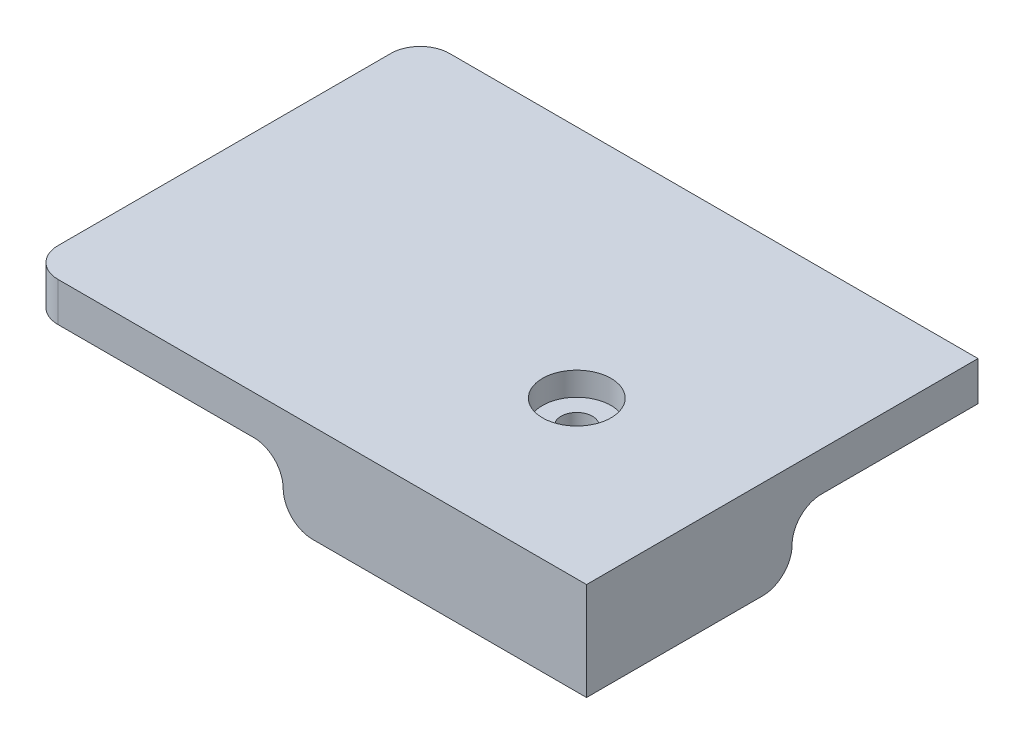
ISO-10303-21;
HEADER;
FILE_DESCRIPTION(('STEP AP214'),'2;1');
FILE_NAME('part.step','',(''),(''),'','','');
FILE_SCHEMA(('AUTOMOTIVE_DESIGN { 1 0 10303 214 1 1 1 1 }'));
ENDSEC;
DATA;
#1=APPLICATION_CONTEXT('core data for automotive mechanical design processes');
#2=APPLICATION_PROTOCOL_DEFINITION('international standard','automotive_design',2000,#1);
#3=PRODUCT_CONTEXT('',#1,'mechanical');
#4=PRODUCT('Part','Part','',(#3));
#5=PRODUCT_RELATED_PRODUCT_CATEGORY('part','',(#4));
#6=PRODUCT_DEFINITION_FORMATION('','',#4);
#7=PRODUCT_DEFINITION_CONTEXT('part definition',#1,'design');
#8=PRODUCT_DEFINITION('design','',#6,#7);
#9=PRODUCT_DEFINITION_SHAPE('','',#8);
#10=(LENGTH_UNIT() NAMED_UNIT(*) SI_UNIT(.MILLI.,.METRE.));
#11=(NAMED_UNIT(*) PLANE_ANGLE_UNIT() SI_UNIT($,.RADIAN.));
#12=(NAMED_UNIT(*) SI_UNIT($,.STERADIAN.) SOLID_ANGLE_UNIT());
#13=UNCERTAINTY_MEASURE_WITH_UNIT(LENGTH_MEASURE(1.E-05),#10,'distance_accuracy_value','');
#14=(GEOMETRIC_REPRESENTATION_CONTEXT(3) GLOBAL_UNCERTAINTY_ASSIGNED_CONTEXT((#13)) GLOBAL_UNIT_ASSIGNED_CONTEXT((#10,
#11,#12)) REPRESENTATION_CONTEXT('',''));
#15=CARTESIAN_POINT('',(0.,0.,0.));
#16=DIRECTION('',(0.,0.,1.));
#17=DIRECTION('',(1.,0.,0.));
#18=AXIS2_PLACEMENT_3D('',#15,#16,#17);
#19=CARTESIAN_POINT('',(0.,-4.,0.));
#20=DIRECTION('',(0.,1.,0.));
#21=DIRECTION('',(0.,0.,1.));
#22=AXIS2_PLACEMENT_3D('',#19,#20,#21);
#23=PLANE('',#22);
#24=DIRECTION('',(1.,0.,0.));
#25=VECTOR('',#24,1.);
#26=CARTESIAN_POINT('',(-28.5,-4.,20.));
#27=LINE('',#26,#25);
#28=CARTESIAN_POINT('',(-25.5,-4.,20.));
#29=VERTEX_POINT('',#28);
#30=CARTESIAN_POINT('',(-5.5,-4.,20.));
#31=VERTEX_POINT('',#30);
#32=EDGE_CURVE('E199',#29,#31,#27,.T.);
#33=ORIENTED_EDGE('',*,*,#32,.F.);
#34=CARTESIAN_POINT('',(-25.5,-4.,17.));
#35=DIRECTION('',(0.,1.,0.));
#36=DIRECTION('',(0.,0.,1.));
#37=AXIS2_PLACEMENT_3D('',#34,#35,#36);
#38=CIRCLE('',#37,3.);
#39=CARTESIAN_POINT('',(-28.5,-4.,17.));
#40=VERTEX_POINT('',#39);
#41=EDGE_CURVE('E166',#29,#40,#38,.F.);
#42=ORIENTED_EDGE('',*,*,#41,.T.);
#43=DIRECTION('',(0.,0.,1.));
#44=VECTOR('',#43,1.);
#45=CARTESIAN_POINT('',(-28.5,-4.,-20.));
#46=LINE('',#45,#44);
#47=CARTESIAN_POINT('',(-28.5,-4.,-17.));
#48=VERTEX_POINT('',#47);
#49=EDGE_CURVE('E223',#48,#40,#46,.T.);
#50=ORIENTED_EDGE('',*,*,#49,.F.);
#51=CARTESIAN_POINT('',(-25.5,-4.,-17.));
#52=DIRECTION('',(0.,1.,0.));
#53=DIRECTION('',(0.,0.,1.));
#54=AXIS2_PLACEMENT_3D('',#51,#52,#53);
#55=CIRCLE('',#54,3.);
#56=CARTESIAN_POINT('',(-25.5,-4.,-20.));
#57=VERTEX_POINT('',#56);
#58=EDGE_CURVE('E169',#48,#57,#55,.F.);
#59=ORIENTED_EDGE('',*,*,#58,.T.);
#60=DIRECTION('',(-1.,0.,0.));
#61=VECTOR('',#60,1.);
#62=CARTESIAN_POINT('',(-28.5,-4.,-20.));
#63=LINE('',#62,#61);
#64=CARTESIAN_POINT('',(28.5,-4.,-20.));
#65=VERTEX_POINT('',#64);
#66=EDGE_CURVE('E227',#65,#57,#63,.T.);
#67=ORIENTED_EDGE('',*,*,#66,.F.);
#68=DIRECTION('',(0.,0.,-1.));
#69=VECTOR('',#68,1.);
#70=CARTESIAN_POINT('',(28.5,-4.,-20.));
#71=LINE('',#70,#69);
#72=CARTESIAN_POINT('',(28.5,-4.,-4.));
#73=VERTEX_POINT('',#72);
#74=EDGE_CURVE('E206',#73,#65,#71,.T.);
#75=ORIENTED_EDGE('',*,*,#74,.F.);
#76=DIRECTION('',(1.,0.,0.));
#77=VECTOR('',#76,1.);
#78=CARTESIAN_POINT('',(-2.5,-4.,-4.00000000000001));
#79=LINE('',#78,#77);
#80=CARTESIAN_POINT('',(-5.5,-4.,-4.00000000000001));
#81=VERTEX_POINT('',#80);
#82=EDGE_CURVE('E172',#73,#81,#79,.F.);
#83=ORIENTED_EDGE('',*,*,#82,.T.);
#84=DIRECTION('',(0.,0.,-1.));
#85=VECTOR('',#84,1.);
#86=CARTESIAN_POINT('',(-5.5,-4.,20.));
#87=LINE('',#86,#85);
#88=EDGE_CURVE('E127',#81,#31,#87,.F.);
#89=ORIENTED_EDGE('',*,*,#88,.T.);
#90=EDGE_LOOP('',(#33,#42,#50,#59,#67,#75,#83,#89));
#91=FACE_BOUND('',#90,.T.);
#92=ADVANCED_FACE('F39',(#91),#23,.F.);
#93=CARTESIAN_POINT('',(28.5,-4.,-20.));
#94=DIRECTION('',(1.,0.,0.));
#95=DIRECTION('',(0.,0.,-1.));
#96=AXIS2_PLACEMENT_3D('',#93,#94,#95);
#97=PLANE('',#96);
#98=DIRECTION('',(0.,0.,1.));
#99=VECTOR('',#98,1.);
#100=CARTESIAN_POINT('',(28.5,-10.,20.));
#101=LINE('',#100,#99);
#102=CARTESIAN_POINT('',(28.5,-10.,2.));
#103=VERTEX_POINT('',#102);
#104=CARTESIAN_POINT('',(28.5,-10.,20.));
#105=VERTEX_POINT('',#104);
#106=EDGE_CURVE('E116',#103,#105,#101,.T.);
#107=ORIENTED_EDGE('',*,*,#106,.F.);
#108=CARTESIAN_POINT('',(28.5,-7.,2.));
#109=DIRECTION('',(1.,0.,0.));
#110=DIRECTION('',(0.,0.,-1.));
#111=AXIS2_PLACEMENT_3D('',#108,#109,#110);
#112=CIRCLE('',#111,3.);
#113=CARTESIAN_POINT('',(28.5,-7.,-1.));
#114=VERTEX_POINT('',#113);
#115=EDGE_CURVE('E58',#103,#114,#112,.T.);
#116=ORIENTED_EDGE('',*,*,#115,.T.);
#117=CARTESIAN_POINT('',(28.5,-7.,-4.));
#118=DIRECTION('',(1.,0.,0.));
#119=DIRECTION('',(0.,0.,-1.));
#120=AXIS2_PLACEMENT_3D('',#117,#118,#119);
#121=CIRCLE('',#120,3.);
#122=EDGE_CURVE('E50',#114,#73,#121,.F.);
#123=ORIENTED_EDGE('',*,*,#122,.T.);
#124=ORIENTED_EDGE('',*,*,#74,.T.);
#125=DIRECTION('',(0.,1.,0.));
#126=VECTOR('',#125,1.);
#127=CARTESIAN_POINT('',(28.5,-4.,-20.));
#128=LINE('',#127,#126);
#129=CARTESIAN_POINT('',(28.5,0.,-20.));
#130=VERTEX_POINT('',#129);
#131=EDGE_CURVE('E196',#65,#130,#128,.T.);
#132=ORIENTED_EDGE('',*,*,#131,.T.);
#133=DIRECTION('',(0.,0.,-1.));
#134=VECTOR('',#133,1.);
#135=CARTESIAN_POINT('',(28.5,0.,-20.));
#136=LINE('',#135,#134);
#137=CARTESIAN_POINT('',(28.5,0.,20.));
#138=VERTEX_POINT('',#137);
#139=EDGE_CURVE('E215',#138,#130,#136,.T.);
#140=ORIENTED_EDGE('',*,*,#139,.F.);
#141=DIRECTION('',(0.,1.,0.));
#142=VECTOR('',#141,1.);
#143=CARTESIAN_POINT('',(28.5,-4.,20.));
#144=LINE('',#143,#142);
#145=EDGE_CURVE('E195',#105,#138,#144,.T.);
#146=ORIENTED_EDGE('',*,*,#145,.F.);
#147=EDGE_LOOP('',(#107,#116,#123,#124,#132,#140,#146));
#148=FACE_BOUND('',#147,.T.);
#149=ADVANCED_FACE('F280',(#148),#97,.T.);
#150=CARTESIAN_POINT('',(-28.5,-4.,20.));
#151=DIRECTION('',(0.,0.,1.));
#152=DIRECTION('',(1.,0.,0.));
#153=AXIS2_PLACEMENT_3D('',#150,#151,#152);
#154=PLANE('',#153);
#155=DIRECTION('',(1.,0.,0.));
#156=VECTOR('',#155,1.);
#157=CARTESIAN_POINT('',(-28.5,0.,20.));
#158=LINE('',#157,#156);
#159=CARTESIAN_POINT('',(-25.5,0.,20.));
#160=VERTEX_POINT('',#159);
#161=EDGE_CURVE('E203',#160,#138,#158,.T.);
#162=ORIENTED_EDGE('',*,*,#161,.F.);
#163=DIRECTION('',(0.,1.,0.));
#164=VECTOR('',#163,1.);
#165=CARTESIAN_POINT('',(-25.5,-4.,20.));
#166=LINE('',#165,#164);
#167=EDGE_CURVE('E177',#160,#29,#166,.F.);
#168=ORIENTED_EDGE('',*,*,#167,.T.);
#169=ORIENTED_EDGE('',*,*,#32,.T.);
#170=CARTESIAN_POINT('',(-5.5,-7.,20.));
#171=DIRECTION('',(0.,0.,1.));
#172=DIRECTION('',(1.,0.,0.));
#173=AXIS2_PLACEMENT_3D('',#170,#171,#172);
#174=CIRCLE('',#173,3.);
#175=CARTESIAN_POINT('',(-2.5,-7.,20.));
#176=VERTEX_POINT('',#175);
#177=EDGE_CURVE('E11',#31,#176,#174,.F.);
#178=ORIENTED_EDGE('',*,*,#177,.T.);
#179=CARTESIAN_POINT('',(0.500000000000001,-7.,20.));
#180=DIRECTION('',(0.,0.,1.));
#181=DIRECTION('',(1.,0.,0.));
#182=AXIS2_PLACEMENT_3D('',#179,#180,#181);
#183=CIRCLE('',#182,3.);
#184=CARTESIAN_POINT('',(0.5,-10.,20.));
#185=VERTEX_POINT('',#184);
#186=EDGE_CURVE('E140',#176,#185,#183,.T.);
#187=ORIENTED_EDGE('',*,*,#186,.T.);
#188=DIRECTION('',(-1.,0.,0.));
#189=VECTOR('',#188,1.);
#190=CARTESIAN_POINT('',(28.5,-10.,20.));
#191=LINE('',#190,#189);
#192=EDGE_CURVE('E219',#105,#185,#191,.T.);
#193=ORIENTED_EDGE('',*,*,#192,.F.);
#194=ORIENTED_EDGE('',*,*,#145,.T.);
#195=EDGE_LOOP('',(#162,#168,#169,#178,#187,#193,#194));
#196=FACE_BOUND('',#195,.T.);
#197=ADVANCED_FACE('F283',(#196),#154,.T.);
#198=CARTESIAN_POINT('',(-28.5,-4.,-20.));
#199=DIRECTION('',(-1.,0.,0.));
#200=DIRECTION('',(0.,0.,1.));
#201=AXIS2_PLACEMENT_3D('',#198,#199,#200);
#202=PLANE('',#201);
#203=ORIENTED_EDGE('',*,*,#49,.T.);
#204=DIRECTION('',(0.,1.,0.));
#205=VECTOR('',#204,1.);
#206=CARTESIAN_POINT('',(-28.5,-4.,17.));
#207=LINE('',#206,#205);
#208=CARTESIAN_POINT('',(-28.5,0.,17.));
#209=VERTEX_POINT('',#208);
#210=EDGE_CURVE('E188',#40,#209,#207,.T.);
#211=ORIENTED_EDGE('',*,*,#210,.T.);
#212=DIRECTION('',(0.,0.,1.));
#213=VECTOR('',#212,1.);
#214=CARTESIAN_POINT('',(-28.5,0.,-20.));
#215=LINE('',#214,#213);
#216=CARTESIAN_POINT('',(-28.5,0.,-17.));
#217=VERTEX_POINT('',#216);
#218=EDGE_CURVE('E207',#217,#209,#215,.T.);
#219=ORIENTED_EDGE('',*,*,#218,.F.);
#220=DIRECTION('',(0.,1.,0.));
#221=VECTOR('',#220,1.);
#222=CARTESIAN_POINT('',(-28.5,-4.,-17.));
#223=LINE('',#222,#221);
#224=EDGE_CURVE('E192',#217,#48,#223,.F.);
#225=ORIENTED_EDGE('',*,*,#224,.T.);
#226=EDGE_LOOP('',(#203,#211,#219,#225));
#227=FACE_BOUND('',#226,.T.);
#228=ADVANCED_FACE('F265',(#227),#202,.T.);
#229=CARTESIAN_POINT('',(-28.5,-4.,-20.));
#230=DIRECTION('',(0.,0.,-1.));
#231=DIRECTION('',(-1.,0.,0.));
#232=AXIS2_PLACEMENT_3D('',#229,#230,#231);
#233=PLANE('',#232);
#234=ORIENTED_EDGE('',*,*,#66,.T.);
#235=DIRECTION('',(0.,1.,0.));
#236=VECTOR('',#235,1.);
#237=CARTESIAN_POINT('',(-25.5,-4.,-20.));
#238=LINE('',#237,#236);
#239=CARTESIAN_POINT('',(-25.5,0.,-20.));
#240=VERTEX_POINT('',#239);
#241=EDGE_CURVE('E162',#57,#240,#238,.T.);
#242=ORIENTED_EDGE('',*,*,#241,.T.);
#243=DIRECTION('',(-1.,0.,0.));
#244=VECTOR('',#243,1.);
#245=CARTESIAN_POINT('',(-28.5,0.,-20.));
#246=LINE('',#245,#244);
#247=EDGE_CURVE('E211',#130,#240,#246,.T.);
#248=ORIENTED_EDGE('',*,*,#247,.F.);
#249=ORIENTED_EDGE('',*,*,#131,.F.);
#250=EDGE_LOOP('',(#234,#242,#248,#249));
#251=FACE_BOUND('',#250,.T.);
#252=ADVANCED_FACE('F259',(#251),#233,.T.);
#253=CARTESIAN_POINT('',(0.,0.,0.));
#254=DIRECTION('',(0.,1.,0.));
#255=DIRECTION('',(0.,0.,1.));
#256=AXIS2_PLACEMENT_3D('',#253,#254,#255);
#257=PLANE('',#256);
#258=CARTESIAN_POINT('',(11.5,0.,4.));
#259=DIRECTION('',(0.,1.,0.));
#260=DIRECTION('',(0.,0.,1.));
#261=AXIS2_PLACEMENT_3D('',#258,#259,#260);
#262=CIRCLE('',#261,3.5);
#263=CARTESIAN_POINT('',(11.5,0.,7.5));
#264=VERTEX_POINT('',#263);
#265=EDGE_CURVE('E132',#264,#264,#262,.T.);
#266=ORIENTED_EDGE('',*,*,#265,.F.);
#267=EDGE_LOOP('',(#266));
#268=FACE_BOUND('',#267,.T.);
#269=ORIENTED_EDGE('',*,*,#218,.T.);
#270=CARTESIAN_POINT('',(-25.5,0.,17.));
#271=DIRECTION('',(0.,1.,0.));
#272=DIRECTION('',(0.,0.,1.));
#273=AXIS2_PLACEMENT_3D('',#270,#271,#272);
#274=CIRCLE('',#273,3.);
#275=EDGE_CURVE('E182',#209,#160,#274,.T.);
#276=ORIENTED_EDGE('',*,*,#275,.T.);
#277=ORIENTED_EDGE('',*,*,#161,.T.);
#278=ORIENTED_EDGE('',*,*,#139,.T.);
#279=ORIENTED_EDGE('',*,*,#247,.T.);
#280=CARTESIAN_POINT('',(-25.5,0.,-17.));
#281=DIRECTION('',(0.,1.,0.));
#282=DIRECTION('',(0.,0.,1.));
#283=AXIS2_PLACEMENT_3D('',#280,#281,#282);
#284=CIRCLE('',#283,3.);
#285=EDGE_CURVE('E185',#240,#217,#284,.T.);
#286=ORIENTED_EDGE('',*,*,#285,.T.);
#287=EDGE_LOOP('',(#269,#276,#277,#278,#279,#286));
#288=FACE_BOUND('',#287,.T.);
#289=ADVANCED_FACE('F255',(#268,#288),#257,.T.);
#290=CARTESIAN_POINT('',(0.,-10.,0.));
#291=DIRECTION('',(0.,1.,0.));
#292=DIRECTION('',(0.,0.,1.));
#293=AXIS2_PLACEMENT_3D('',#290,#291,#292);
#294=PLANE('',#293);
#295=CARTESIAN_POINT('',(11.5,-10.,4.));
#296=DIRECTION('',(0.,1.,0.));
#297=DIRECTION('',(0.,0.,1.));
#298=AXIS2_PLACEMENT_3D('',#295,#296,#297);
#299=CIRCLE('',#298,1.6);
#300=CARTESIAN_POINT('',(11.5,-10.,5.6));
#301=VERTEX_POINT('',#300);
#302=EDGE_CURVE('E237',#301,#301,#299,.T.);
#303=ORIENTED_EDGE('',*,*,#302,.T.);
#304=EDGE_LOOP('',(#303));
#305=FACE_BOUND('',#304,.T.);
#306=DIRECTION('',(0.,0.,-1.));
#307=VECTOR('',#306,1.);
#308=CARTESIAN_POINT('',(0.500000000000001,-10.,0.));
#309=LINE('',#308,#307);
#310=CARTESIAN_POINT('',(0.500000000000001,-10.,1.99999999999999));
#311=VERTEX_POINT('',#310);
#312=EDGE_CURVE('E159',#185,#311,#309,.T.);
#313=ORIENTED_EDGE('',*,*,#312,.T.);
#314=DIRECTION('',(1.,0.,0.));
#315=VECTOR('',#314,1.);
#316=CARTESIAN_POINT('',(0.,-10.,1.99999999999999));
#317=LINE('',#316,#315);
#318=EDGE_CURVE('E149',#311,#103,#317,.T.);
#319=ORIENTED_EDGE('',*,*,#318,.T.);
#320=ORIENTED_EDGE('',*,*,#106,.T.);
#321=ORIENTED_EDGE('',*,*,#192,.T.);
#322=EDGE_LOOP('',(#313,#319,#320,#321));
#323=FACE_BOUND('',#322,.T.);
#324=ADVANCED_FACE('F258',(#305,#323),#294,.F.);
#325=CARTESIAN_POINT('',(11.5,0.,4.));
#326=DIRECTION('',(0.,1.,0.));
#327=DIRECTION('',(0.,0.,1.));
#328=AXIS2_PLACEMENT_3D('',#325,#326,#327);
#329=CYLINDRICAL_SURFACE('',#328,1.6);
#330=ORIENTED_EDGE('',*,*,#302,.F.);
#331=EDGE_LOOP('',(#330));
#332=FACE_BOUND('',#331,.T.);
#333=CARTESIAN_POINT('',(11.5,-2.4,4.));
#334=DIRECTION('',(0.,1.,0.));
#335=DIRECTION('',(0.,0.,1.));
#336=AXIS2_PLACEMENT_3D('',#333,#334,#335);
#337=CIRCLE('',#336,1.6);
#338=CARTESIAN_POINT('',(11.5,-2.4,5.6));
#339=VERTEX_POINT('',#338);
#340=EDGE_CURVE('E241',#339,#339,#337,.T.);
#341=ORIENTED_EDGE('',*,*,#340,.T.);
#342=EDGE_LOOP('',(#341));
#343=FACE_BOUND('',#342,.T.);
#344=ADVANCED_FACE('F325',(#332,#343),#329,.F.);
#345=CARTESIAN_POINT('',(13.1,-2.4,4.));
#346=DIRECTION('',(0.,-1.,0.));
#347=DIRECTION('',(0.,0.,-1.));
#348=AXIS2_PLACEMENT_3D('',#345,#346,#347);
#349=PLANE('',#348);
#350=ORIENTED_EDGE('',*,*,#340,.F.);
#351=EDGE_LOOP('',(#350));
#352=FACE_BOUND('',#351,.T.);
#353=CARTESIAN_POINT('',(11.5,-2.4,4.));
#354=DIRECTION('',(0.,1.,0.));
#355=DIRECTION('',(0.,0.,1.));
#356=AXIS2_PLACEMENT_3D('',#353,#354,#355);
#357=CIRCLE('',#356,3.5);
#358=CARTESIAN_POINT('',(11.5,-2.4,7.5));
#359=VERTEX_POINT('',#358);
#360=EDGE_CURVE('E245',#359,#359,#357,.T.);
#361=ORIENTED_EDGE('',*,*,#360,.T.);
#362=EDGE_LOOP('',(#361));
#363=FACE_BOUND('',#362,.T.);
#364=ADVANCED_FACE('F294',(#352,#363),#349,.F.);
#365=CARTESIAN_POINT('',(11.5,0.,4.));
#366=DIRECTION('',(0.,1.,0.));
#367=DIRECTION('',(0.,0.,1.));
#368=AXIS2_PLACEMENT_3D('',#365,#366,#367);
#369=CYLINDRICAL_SURFACE('',#368,3.5);
#370=ORIENTED_EDGE('',*,*,#360,.F.);
#371=EDGE_LOOP('',(#370));
#372=FACE_BOUND('',#371,.T.);
#373=ORIENTED_EDGE('',*,*,#265,.T.);
#374=EDGE_LOOP('',(#373));
#375=FACE_BOUND('',#374,.T.);
#376=ADVANCED_FACE('F253',(#372,#375),#369,.F.);
#377=CARTESIAN_POINT('',(-25.5,-4.,17.));
#378=DIRECTION('',(0.,1.,0.));
#379=DIRECTION('',(0.,0.,1.));
#380=AXIS2_PLACEMENT_3D('',#377,#378,#379);
#381=CYLINDRICAL_SURFACE('',#380,3.);
#382=ORIENTED_EDGE('',*,*,#41,.F.);
#383=ORIENTED_EDGE('',*,*,#167,.F.);
#384=ORIENTED_EDGE('',*,*,#275,.F.);
#385=ORIENTED_EDGE('',*,*,#210,.F.);
#386=EDGE_LOOP('',(#382,#383,#384,#385));
#387=FACE_BOUND('',#386,.T.);
#388=ADVANCED_FACE('F286',(#387),#381,.T.);
#389=CARTESIAN_POINT('',(-25.5,-4.,-17.));
#390=DIRECTION('',(0.,1.,0.));
#391=DIRECTION('',(0.,0.,1.));
#392=AXIS2_PLACEMENT_3D('',#389,#390,#391);
#393=CYLINDRICAL_SURFACE('',#392,3.);
#394=ORIENTED_EDGE('',*,*,#58,.F.);
#395=ORIENTED_EDGE('',*,*,#224,.F.);
#396=ORIENTED_EDGE('',*,*,#285,.F.);
#397=ORIENTED_EDGE('',*,*,#241,.F.);
#398=EDGE_LOOP('',(#394,#395,#396,#397));
#399=FACE_BOUND('',#398,.T.);
#400=ADVANCED_FACE('F270',(#399),#393,.T.);
#401=CARTESIAN_POINT('',(-5.5,-7.,20.));
#402=DIRECTION('',(0.,0.,1.));
#403=DIRECTION('',(1.,0.,0.));
#404=AXIS2_PLACEMENT_3D('',#401,#402,#403);
#405=CYLINDRICAL_SURFACE('',#404,3.);
#406=ORIENTED_EDGE('',*,*,#177,.F.);
#407=ORIENTED_EDGE('',*,*,#88,.F.);
#408=CARTESIAN_POINT('',(-5.5,-7.,-4.00000000000001));
#409=DIRECTION('',(-0.707106781186548,0.,0.707106781186547));
#410=DIRECTION('',(0.707106781186547,0.,0.707106781186548));
#411=AXIS2_PLACEMENT_3D('',#408,#409,#410);
#412=ELLIPSE('',#411,4.24264068711929,3.);
#413=CARTESIAN_POINT('',(-2.5,-7.,-1.00000000000001));
#414=VERTEX_POINT('',#413);
#415=EDGE_CURVE('E43',#414,#81,#412,.T.);
#416=ORIENTED_EDGE('',*,*,#415,.F.);
#417=DIRECTION('',(0.,0.,-1.));
#418=VECTOR('',#417,1.);
#419=CARTESIAN_POINT('',(-2.5,-7.,-1.00000000000001));
#420=LINE('',#419,#418);
#421=EDGE_CURVE('E125',#176,#414,#420,.T.);
#422=ORIENTED_EDGE('',*,*,#421,.F.);
#423=EDGE_LOOP('',(#406,#407,#416,#422));
#424=FACE_BOUND('',#423,.T.);
#425=ADVANCED_FACE('F41',(#424),#405,.F.);
#426=CARTESIAN_POINT('',(28.5,-7.,-4.));
#427=DIRECTION('',(-1.,0.,0.));
#428=DIRECTION('',(0.,0.,1.));
#429=AXIS2_PLACEMENT_3D('',#426,#427,#428);
#430=CYLINDRICAL_SURFACE('',#429,3.);
#431=ORIENTED_EDGE('',*,*,#82,.F.);
#432=ORIENTED_EDGE('',*,*,#122,.F.);
#433=DIRECTION('',(1.,0.,0.));
#434=VECTOR('',#433,1.);
#435=CARTESIAN_POINT('',(28.5,-7.,-1.));
#436=LINE('',#435,#434);
#437=EDGE_CURVE('E142',#414,#114,#436,.T.);
#438=ORIENTED_EDGE('',*,*,#437,.F.);
#439=ORIENTED_EDGE('',*,*,#415,.T.);
#440=EDGE_LOOP('',(#431,#432,#438,#439));
#441=FACE_BOUND('',#440,.T.);
#442=ADVANCED_FACE('F144',(#441),#430,.F.);
#443=CARTESIAN_POINT('',(0.500000000000001,-7.,0.));
#444=DIRECTION('',(0.,0.,-1.));
#445=DIRECTION('',(-1.,0.,0.));
#446=AXIS2_PLACEMENT_3D('',#443,#444,#445);
#447=CYLINDRICAL_SURFACE('',#446,3.);
#448=ORIENTED_EDGE('',*,*,#186,.F.);
#449=ORIENTED_EDGE('',*,*,#421,.T.);
#450=CARTESIAN_POINT('',(0.500000000000001,-7.,1.99999999999999));
#451=DIRECTION('',(0.707106781186548,0.,-0.707106781186547));
#452=DIRECTION('',(-0.707106781186547,0.,-0.707106781186548));
#453=AXIS2_PLACEMENT_3D('',#450,#451,#452);
#454=ELLIPSE('',#453,4.24264068711929,3.);
#455=EDGE_CURVE('E138',#311,#414,#454,.T.);
#456=ORIENTED_EDGE('',*,*,#455,.F.);
#457=ORIENTED_EDGE('',*,*,#312,.F.);
#458=EDGE_LOOP('',(#448,#449,#456,#457));
#459=FACE_BOUND('',#458,.T.);
#460=ADVANCED_FACE('F135',(#459),#447,.T.);
#461=CARTESIAN_POINT('',(0.,-7.,1.99999999999999));
#462=DIRECTION('',(1.,0.,0.));
#463=DIRECTION('',(0.,0.,-1.));
#464=AXIS2_PLACEMENT_3D('',#461,#462,#463);
#465=CYLINDRICAL_SURFACE('',#464,3.);
#466=ORIENTED_EDGE('',*,*,#455,.T.);
#467=ORIENTED_EDGE('',*,*,#437,.T.);
#468=ORIENTED_EDGE('',*,*,#115,.F.);
#469=ORIENTED_EDGE('',*,*,#318,.F.);
#470=EDGE_LOOP('',(#466,#467,#468,#469));
#471=FACE_BOUND('',#470,.T.);
#472=ADVANCED_FACE('F148',(#471),#465,.T.);
#473=CLOSED_SHELL('',(#92,#149,#197,#228,#252,#289,#324,#344,#364,#376,#388,#400,#425,#442,#460,#472));
#474=MANIFOLD_SOLID_BREP('B2',#473);
#475=ADVANCED_BREP_SHAPE_REPRESENTATION('',(#18,#474),#14);
#476=SHAPE_DEFINITION_REPRESENTATION(#9,#475);
ENDSEC;
END-ISO-10303-21;
